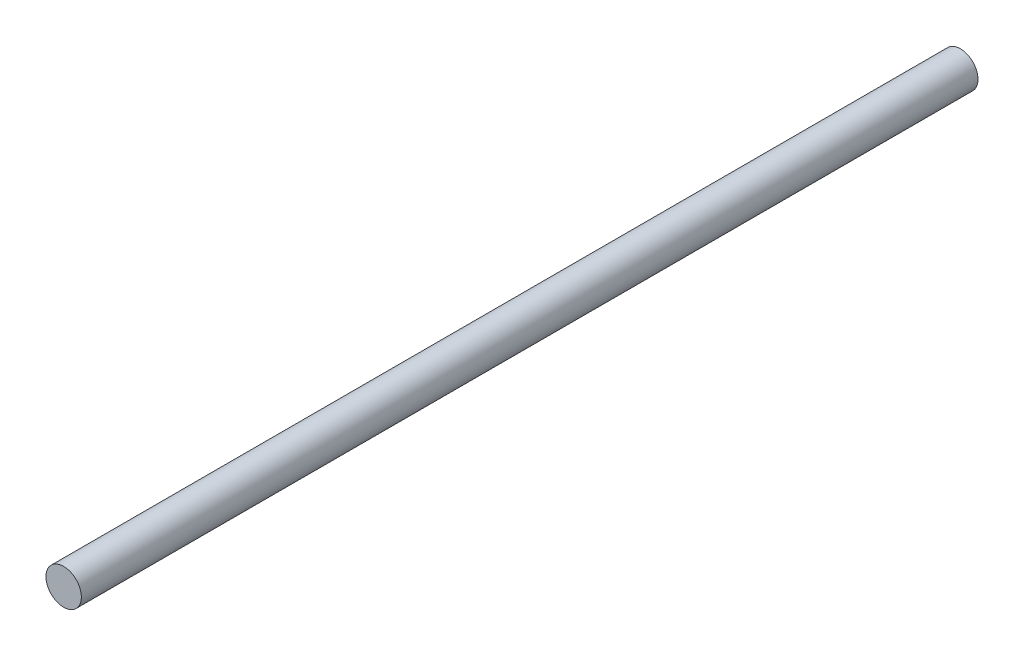
ISO-10303-21;
HEADER;
FILE_DESCRIPTION(('STEP AP214'),'2;1');
FILE_NAME('part.step','',(''),(''),'','','');
FILE_SCHEMA(('AUTOMOTIVE_DESIGN { 1 0 10303 214 1 1 1 1 }'));
ENDSEC;
DATA;
#1=APPLICATION_CONTEXT('core data for automotive mechanical design processes');
#2=APPLICATION_PROTOCOL_DEFINITION('international standard','automotive_design',2000,#1);
#3=PRODUCT_CONTEXT('',#1,'mechanical');
#4=PRODUCT('Part','Part','',(#3));
#5=PRODUCT_RELATED_PRODUCT_CATEGORY('part','',(#4));
#6=PRODUCT_DEFINITION_FORMATION('','',#4);
#7=PRODUCT_DEFINITION_CONTEXT('part definition',#1,'design');
#8=PRODUCT_DEFINITION('design','',#6,#7);
#9=PRODUCT_DEFINITION_SHAPE('','',#8);
#10=(LENGTH_UNIT() NAMED_UNIT(*) SI_UNIT(.MILLI.,.METRE.));
#11=(NAMED_UNIT(*) PLANE_ANGLE_UNIT() SI_UNIT($,.RADIAN.));
#12=(NAMED_UNIT(*) SI_UNIT($,.STERADIAN.) SOLID_ANGLE_UNIT());
#13=UNCERTAINTY_MEASURE_WITH_UNIT(LENGTH_MEASURE(1.E-05),#10,'distance_accuracy_value','');
#14=(GEOMETRIC_REPRESENTATION_CONTEXT(3) GLOBAL_UNCERTAINTY_ASSIGNED_CONTEXT((#13)) GLOBAL_UNIT_ASSIGNED_CONTEXT((#10,
#11,#12)) REPRESENTATION_CONTEXT('',''));
#15=CARTESIAN_POINT('',(0.,0.,0.));
#16=DIRECTION('',(0.,0.,1.));
#17=DIRECTION('',(1.,0.,0.));
#18=AXIS2_PLACEMENT_3D('',#15,#16,#17);
#19=CARTESIAN_POINT('',(0.,0.,38.));
#20=DIRECTION('',(0.,0.,-1.));
#21=DIRECTION('',(-1.,0.,0.));
#22=AXIS2_PLACEMENT_3D('',#19,#20,#21);
#23=CYLINDRICAL_SURFACE('',#22,0.75);
#24=CARTESIAN_POINT('',(0.,0.,38.));
#25=DIRECTION('',(0.,0.,1.));
#26=DIRECTION('',(1.,0.,0.));
#27=AXIS2_PLACEMENT_3D('',#24,#25,#26);
#28=CIRCLE('',#27,0.75);
#29=CARTESIAN_POINT('',(0.75,0.,38.));
#30=VERTEX_POINT('',#29);
#31=EDGE_CURVE('E10',#30,#30,#28,.T.);
#32=ORIENTED_EDGE('',*,*,#31,.F.);
#33=EDGE_LOOP('',(#32));
#34=FACE_BOUND('',#33,.T.);
#35=CARTESIAN_POINT('',(0.,0.,0.));
#36=DIRECTION('',(0.,0.,1.));
#37=DIRECTION('',(1.,0.,0.));
#38=AXIS2_PLACEMENT_3D('',#35,#36,#37);
#39=CIRCLE('',#38,0.75);
#40=CARTESIAN_POINT('',(0.75,0.,0.));
#41=VERTEX_POINT('',#40);
#42=EDGE_CURVE('E37',#41,#41,#39,.T.);
#43=ORIENTED_EDGE('',*,*,#42,.T.);
#44=EDGE_LOOP('',(#43));
#45=FACE_BOUND('',#44,.T.);
#46=ADVANCED_FACE('F34',(#34,#45),#23,.T.);
#47=CARTESIAN_POINT('',(0.,0.,38.));
#48=DIRECTION('',(0.,0.,1.));
#49=DIRECTION('',(1.,0.,0.));
#50=AXIS2_PLACEMENT_3D('',#47,#48,#49);
#51=PLANE('',#50);
#52=ORIENTED_EDGE('',*,*,#31,.T.);
#53=EDGE_LOOP('',(#52));
#54=FACE_BOUND('',#53,.T.);
#55=ADVANCED_FACE('F49',(#54),#51,.T.);
#56=CARTESIAN_POINT('',(0.,0.,0.));
#57=DIRECTION('',(0.,0.,1.));
#58=DIRECTION('',(1.,0.,0.));
#59=AXIS2_PLACEMENT_3D('',#56,#57,#58);
#60=PLANE('',#59);
#61=ORIENTED_EDGE('',*,*,#42,.F.);
#62=EDGE_LOOP('',(#61));
#63=FACE_BOUND('',#62,.T.);
#64=ADVANCED_FACE('F47',(#63),#60,.F.);
#65=CLOSED_SHELL('',(#46,#55,#64));
#66=MANIFOLD_SOLID_BREP('B2',#65);
#67=ADVANCED_BREP_SHAPE_REPRESENTATION('',(#18,#66),#14);
#68=SHAPE_DEFINITION_REPRESENTATION(#9,#67);
ENDSEC;
END-ISO-10303-21;
